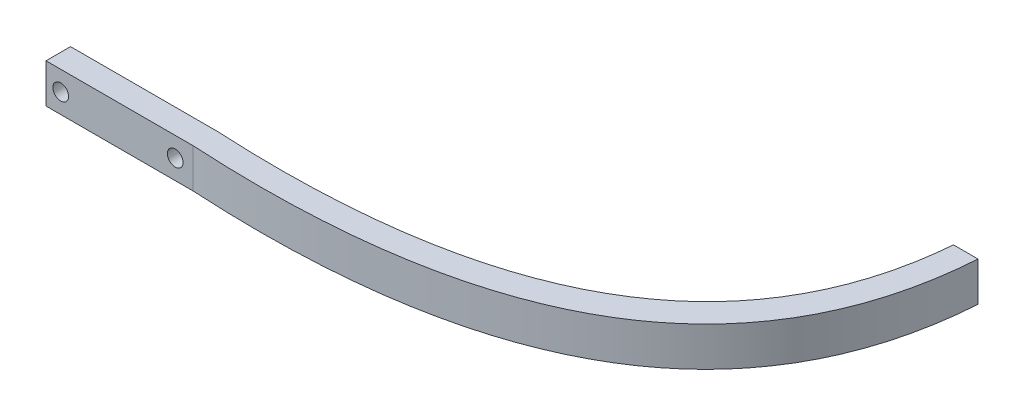
ISO-10303-21;
HEADER;
FILE_DESCRIPTION(('STEP AP214'),'2;1');
FILE_NAME('part.step','',(''),(''),'','','');
FILE_SCHEMA(('AUTOMOTIVE_DESIGN { 1 0 10303 214 1 1 1 1 }'));
ENDSEC;
DATA;
#1=APPLICATION_CONTEXT('core data for automotive mechanical design processes');
#2=APPLICATION_PROTOCOL_DEFINITION('international standard','automotive_design',2000,#1);
#3=PRODUCT_CONTEXT('',#1,'mechanical');
#4=PRODUCT('Part','Part','',(#3));
#5=PRODUCT_RELATED_PRODUCT_CATEGORY('part','',(#4));
#6=PRODUCT_DEFINITION_FORMATION('','',#4);
#7=PRODUCT_DEFINITION_CONTEXT('part definition',#1,'design');
#8=PRODUCT_DEFINITION('design','',#6,#7);
#9=PRODUCT_DEFINITION_SHAPE('','',#8);
#10=(LENGTH_UNIT() NAMED_UNIT(*) SI_UNIT(.MILLI.,.METRE.));
#11=(NAMED_UNIT(*) PLANE_ANGLE_UNIT() SI_UNIT($,.RADIAN.));
#12=(NAMED_UNIT(*) SI_UNIT($,.STERADIAN.) SOLID_ANGLE_UNIT());
#13=UNCERTAINTY_MEASURE_WITH_UNIT(LENGTH_MEASURE(1.E-05),#10,'distance_accuracy_value','');
#14=(GEOMETRIC_REPRESENTATION_CONTEXT(3) GLOBAL_UNCERTAINTY_ASSIGNED_CONTEXT((#13)) GLOBAL_UNIT_ASSIGNED_CONTEXT((#10,
#11,#12)) REPRESENTATION_CONTEXT('',''));
#15=CARTESIAN_POINT('',(0.,0.,0.));
#16=DIRECTION('',(0.,0.,1.));
#17=DIRECTION('',(1.,0.,0.));
#18=AXIS2_PLACEMENT_3D('',#15,#16,#17);
#19=CARTESIAN_POINT('',(25.674832789617,8.,2.23902973954786));
#20=CARTESIAN_POINT('',(121.287593370321,8.,7.64344306096118));
#21=CARTESIAN_POINT('',(125.674832789617,8.,-57.7609702604522));
#22=B_SPLINE_CURVE_WITH_KNOTS('',2,(#19,#20,#21),.UNSPECIFIED.,.F.,.F.,(3,3),(0.,1.),.UNSPECIFIED.);
#23=DIRECTION('',(0.,-1.,0.));
#24=VECTOR('',#23,1.);
#25=SURFACE_OF_LINEAR_EXTRUSION('',#22,#24);
#26=CARTESIAN_POINT('',(25.674832789617,0.,2.23902973954786));
#27=CARTESIAN_POINT('',(121.287593370321,0.,7.64344306096118));
#28=CARTESIAN_POINT('',(125.674832789617,0.,-57.7609702604522));
#29=B_SPLINE_CURVE_WITH_KNOTS('',2,(#26,#27,#28),.UNSPECIFIED.,.F.,.F.,(3,3),(0.,1.),.UNSPECIFIED.);
#30=CARTESIAN_POINT('',(25.6748327896171,0.,2.23902973954786));
#31=VERTEX_POINT('',#30);
#32=CARTESIAN_POINT('',(125.674832789617,0.,-57.7609702604521));
#33=VERTEX_POINT('',#32);
#34=EDGE_CURVE('E188',#31,#33,#29,.T.);
#35=ORIENTED_EDGE('',*,*,#34,.T.);
#36=DIRECTION('',(0.,-1.,0.));
#37=VECTOR('',#36,1.);
#38=CARTESIAN_POINT('',(125.674832789617,8.,-57.7609702604521));
#39=LINE('',#38,#37);
#40=CARTESIAN_POINT('',(125.674832789617,8.,-57.7609702604521));
#41=VERTEX_POINT('',#40);
#42=EDGE_CURVE('E92',#41,#33,#39,.T.);
#43=ORIENTED_EDGE('',*,*,#42,.F.);
#44=CARTESIAN_POINT('',(25.6748327896171,8.,2.23902973954786));
#45=VERTEX_POINT('',#44);
#46=EDGE_CURVE('E180',#45,#41,#22,.T.);
#47=ORIENTED_EDGE('',*,*,#46,.F.);
#48=DIRECTION('',(0.,-1.,0.));
#49=VECTOR('',#48,1.);
#50=CARTESIAN_POINT('',(25.6748327896171,8.,2.23902973954786));
#51=LINE('',#50,#49);
#52=EDGE_CURVE('E12',#45,#31,#51,.T.);
#53=ORIENTED_EDGE('',*,*,#52,.T.);
#54=EDGE_LOOP('',(#35,#43,#47,#53));
#55=FACE_BOUND('',#54,.T.);
#56=ADVANCED_FACE('F81',(#55),#25,.F.);
#57=CARTESIAN_POINT('',(0.,8.,-57.7609702604521));
#58=DIRECTION('',(0.,0.,-1.));
#59=DIRECTION('',(-1.,0.,0.));
#60=AXIS2_PLACEMENT_3D('',#57,#58,#59);
#61=PLANE('',#60);
#62=DIRECTION('',(1.,0.,0.));
#63=VECTOR('',#62,1.);
#64=CARTESIAN_POINT('',(0.,0.,-57.7609702604521));
#65=LINE('',#64,#63);
#66=CARTESIAN_POINT('',(120.674832789617,0.,-57.7609702604521));
#67=VERTEX_POINT('',#66);
#68=EDGE_CURVE('E181',#67,#33,#65,.T.);
#69=ORIENTED_EDGE('',*,*,#68,.F.);
#70=DIRECTION('',(0.,-1.,0.));
#71=VECTOR('',#70,1.);
#72=CARTESIAN_POINT('',(120.674832789617,8.,-57.7609702604521));
#73=LINE('',#72,#71);
#74=CARTESIAN_POINT('',(120.674832789617,8.,-57.7609702604521));
#75=VERTEX_POINT('',#74);
#76=EDGE_CURVE('E169',#75,#67,#73,.T.);
#77=ORIENTED_EDGE('',*,*,#76,.F.);
#78=DIRECTION('',(1.,0.,0.));
#79=VECTOR('',#78,1.);
#80=CARTESIAN_POINT('',(0.,8.,-57.7609702604521));
#81=LINE('',#80,#79);
#82=EDGE_CURVE('E202',#75,#41,#81,.T.);
#83=ORIENTED_EDGE('',*,*,#82,.T.);
#84=ORIENTED_EDGE('',*,*,#42,.T.);
#85=EDGE_LOOP('',(#69,#77,#83,#84));
#86=FACE_BOUND('',#85,.T.);
#87=ADVANCED_FACE('F213',(#86),#61,.T.);
#88=CARTESIAN_POINT('',(25.674832789617,8.,-2.76097026045214));
#89=CARTESIAN_POINT('',(115.693231060421,8.,1.98576260505165));
#90=CARTESIAN_POINT('',(120.674832789617,8.,-57.7609702604522));
#91=B_SPLINE_CURVE_WITH_KNOTS('',2,(#88,#89,#90),.UNSPECIFIED.,.F.,.F.,(3,3),(0.,1.),.UNSPECIFIED.);
#92=DIRECTION('',(0.,-1.,0.));
#93=VECTOR('',#92,1.);
#94=SURFACE_OF_LINEAR_EXTRUSION('',#91,#93);
#95=CARTESIAN_POINT('',(25.674832789617,0.,-2.76097026045214));
#96=CARTESIAN_POINT('',(115.693231060421,0.,1.98576260505165));
#97=CARTESIAN_POINT('',(120.674832789617,0.,-57.7609702604522));
#98=B_SPLINE_CURVE_WITH_KNOTS('',2,(#95,#96,#97),.UNSPECIFIED.,.F.,.F.,(3,3),(0.,1.),.UNSPECIFIED.);
#99=CARTESIAN_POINT('',(25.674832789617,0.,-2.76097026045214));
#100=VERTEX_POINT('',#99);
#101=EDGE_CURVE('E175',#100,#67,#98,.T.);
#102=ORIENTED_EDGE('',*,*,#101,.F.);
#103=DIRECTION('',(0.,-1.,0.));
#104=VECTOR('',#103,1.);
#105=CARTESIAN_POINT('',(25.674832789617,8.,-2.76097026045214));
#106=LINE('',#105,#104);
#107=CARTESIAN_POINT('',(25.674832789617,8.,-2.76097026045214));
#108=VERTEX_POINT('',#107);
#109=EDGE_CURVE('E101',#108,#100,#106,.T.);
#110=ORIENTED_EDGE('',*,*,#109,.F.);
#111=EDGE_CURVE('E174',#108,#75,#91,.T.);
#112=ORIENTED_EDGE('',*,*,#111,.T.);
#113=ORIENTED_EDGE('',*,*,#76,.T.);
#114=EDGE_LOOP('',(#102,#110,#112,#113));
#115=FACE_BOUND('',#114,.T.);
#116=ADVANCED_FACE('F208',(#115),#94,.T.);
#117=CARTESIAN_POINT('',(0.,8.,0.));
#118=DIRECTION('',(0.,1.,0.));
#119=DIRECTION('',(0.,0.,1.));
#120=AXIS2_PLACEMENT_3D('',#117,#118,#119);
#121=PLANE('',#120);
#122=ORIENTED_EDGE('',*,*,#111,.F.);
#123=DIRECTION('',(1.,0.,0.));
#124=VECTOR('',#123,1.);
#125=CARTESIAN_POINT('',(-4.32516721038295,8.,-2.76097026045214));
#126=LINE('',#125,#124);
#127=CARTESIAN_POINT('',(-4.32516721038295,8.,-2.76097026045214));
#128=VERTEX_POINT('',#127);
#129=EDGE_CURVE('E145',#128,#108,#126,.T.);
#130=ORIENTED_EDGE('',*,*,#129,.F.);
#131=DIRECTION('',(0.,0.,1.));
#132=VECTOR('',#131,1.);
#133=CARTESIAN_POINT('',(-4.32516721038295,8.,-2.76097026045214));
#134=LINE('',#133,#132);
#135=CARTESIAN_POINT('',(-4.32516721038294,8.,2.23902973954786));
#136=VERTEX_POINT('',#135);
#137=EDGE_CURVE('E140',#128,#136,#134,.T.);
#138=ORIENTED_EDGE('',*,*,#137,.T.);
#139=DIRECTION('',(1.,0.,0.));
#140=VECTOR('',#139,1.);
#141=CARTESIAN_POINT('',(-4.32516721038294,8.,2.23902973954786));
#142=LINE('',#141,#140);
#143=EDGE_CURVE('E158',#136,#45,#142,.T.);
#144=ORIENTED_EDGE('',*,*,#143,.T.);
#145=ORIENTED_EDGE('',*,*,#46,.T.);
#146=ORIENTED_EDGE('',*,*,#82,.F.);
#147=EDGE_LOOP('',(#122,#130,#138,#144,#145,#146));
#148=FACE_BOUND('',#147,.T.);
#149=ADVANCED_FACE('F212',(#148),#121,.T.);
#150=CARTESIAN_POINT('',(0.,0.,0.));
#151=DIRECTION('',(0.,1.,0.));
#152=DIRECTION('',(0.,0.,1.));
#153=AXIS2_PLACEMENT_3D('',#150,#151,#152);
#154=PLANE('',#153);
#155=ORIENTED_EDGE('',*,*,#34,.F.);
#156=DIRECTION('',(1.,0.,0.));
#157=VECTOR('',#156,1.);
#158=CARTESIAN_POINT('',(-4.32516721038294,0.,2.23902973954786));
#159=LINE('',#158,#157);
#160=CARTESIAN_POINT('',(-4.32516721038294,0.,2.23902973954786));
#161=VERTEX_POINT('',#160);
#162=EDGE_CURVE('E130',#161,#31,#159,.T.);
#163=ORIENTED_EDGE('',*,*,#162,.F.);
#164=DIRECTION('',(0.,0.,1.));
#165=VECTOR('',#164,1.);
#166=CARTESIAN_POINT('',(-4.32516721038295,0.,-2.76097026045214));
#167=LINE('',#166,#165);
#168=CARTESIAN_POINT('',(-4.32516721038295,0.,-2.76097026045214));
#169=VERTEX_POINT('',#168);
#170=EDGE_CURVE('E138',#169,#161,#167,.T.);
#171=ORIENTED_EDGE('',*,*,#170,.F.);
#172=DIRECTION('',(1.,0.,0.));
#173=VECTOR('',#172,1.);
#174=CARTESIAN_POINT('',(-4.32516721038295,0.,-2.76097026045214));
#175=LINE('',#174,#173);
#176=EDGE_CURVE('E149',#169,#100,#175,.T.);
#177=ORIENTED_EDGE('',*,*,#176,.T.);
#178=ORIENTED_EDGE('',*,*,#101,.T.);
#179=ORIENTED_EDGE('',*,*,#68,.T.);
#180=EDGE_LOOP('',(#155,#163,#171,#177,#178,#179));
#181=FACE_BOUND('',#180,.T.);
#182=ADVANCED_FACE('F147',(#181),#154,.F.);
#183=CARTESIAN_POINT('',(-4.32516721038294,8.,2.23902973954786));
#184=DIRECTION('',(0.,0.,-1.));
#185=DIRECTION('',(-1.,0.,0.));
#186=AXIS2_PLACEMENT_3D('',#183,#184,#185);
#187=PLANE('',#186);
#188=CARTESIAN_POINT('',(22.014832789617,4.,2.23902973954786));
#189=DIRECTION('',(0.,0.,-1.));
#190=DIRECTION('',(-1.,0.,0.));
#191=AXIS2_PLACEMENT_3D('',#188,#189,#190);
#192=CIRCLE('',#191,1.6);
#193=CARTESIAN_POINT('',(20.414832789617,4.,2.23902973954786));
#194=VERTEX_POINT('',#193);
#195=EDGE_CURVE('E151',#194,#194,#192,.T.);
#196=ORIENTED_EDGE('',*,*,#195,.T.);
#197=EDGE_LOOP('',(#196));
#198=FACE_BOUND('',#197,.T.);
#199=CARTESIAN_POINT('',(-1.32516721038295,4.,2.23902973954786));
#200=DIRECTION('',(0.,0.,-1.));
#201=DIRECTION('',(-1.,0.,0.));
#202=AXIS2_PLACEMENT_3D('',#199,#200,#201);
#203=CIRCLE('',#202,1.6);
#204=CARTESIAN_POINT('',(-2.92516721038295,4.,2.23902973954786));
#205=VERTEX_POINT('',#204);
#206=EDGE_CURVE('E233',#205,#205,#203,.T.);
#207=ORIENTED_EDGE('',*,*,#206,.T.);
#208=EDGE_LOOP('',(#207));
#209=FACE_BOUND('',#208,.T.);
#210=ORIENTED_EDGE('',*,*,#162,.T.);
#211=ORIENTED_EDGE('',*,*,#52,.F.);
#212=ORIENTED_EDGE('',*,*,#143,.F.);
#213=DIRECTION('',(0.,-1.,0.));
#214=VECTOR('',#213,1.);
#215=CARTESIAN_POINT('',(-4.32516721038294,8.,2.23902973954786));
#216=LINE('',#215,#214);
#217=EDGE_CURVE('E85',#136,#161,#216,.T.);
#218=ORIENTED_EDGE('',*,*,#217,.T.);
#219=EDGE_LOOP('',(#210,#211,#212,#218));
#220=FACE_BOUND('',#219,.T.);
#221=ADVANCED_FACE('F252',(#198,#209,#220),#187,.F.);
#222=CARTESIAN_POINT('',(-4.32516721038295,8.,-2.76097026045214));
#223=DIRECTION('',(1.,0.,0.));
#224=DIRECTION('',(0.,0.,-1.));
#225=AXIS2_PLACEMENT_3D('',#222,#223,#224);
#226=PLANE('',#225);
#227=ORIENTED_EDGE('',*,*,#170,.T.);
#228=ORIENTED_EDGE('',*,*,#217,.F.);
#229=ORIENTED_EDGE('',*,*,#137,.F.);
#230=DIRECTION('',(0.,-1.,0.));
#231=VECTOR('',#230,1.);
#232=CARTESIAN_POINT('',(-4.32516721038295,8.,-2.76097026045214));
#233=LINE('',#232,#231);
#234=EDGE_CURVE('E136',#128,#169,#233,.T.);
#235=ORIENTED_EDGE('',*,*,#234,.T.);
#236=EDGE_LOOP('',(#227,#228,#229,#235));
#237=FACE_BOUND('',#236,.T.);
#238=ADVANCED_FACE('F83',(#237),#226,.F.);
#239=CARTESIAN_POINT('',(-4.32516721038295,8.,-2.76097026045214));
#240=DIRECTION('',(0.,0.,-1.));
#241=DIRECTION('',(-1.,0.,0.));
#242=AXIS2_PLACEMENT_3D('',#239,#240,#241);
#243=PLANE('',#242);
#244=CARTESIAN_POINT('',(22.014832789617,4.,-2.76097026045214));
#245=DIRECTION('',(0.,0.,-1.));
#246=DIRECTION('',(-1.,0.,0.));
#247=AXIS2_PLACEMENT_3D('',#244,#245,#246);
#248=CIRCLE('',#247,1.6);
#249=CARTESIAN_POINT('',(20.414832789617,4.,-2.76097026045214));
#250=VERTEX_POINT('',#249);
#251=EDGE_CURVE('E237',#250,#250,#248,.T.);
#252=ORIENTED_EDGE('',*,*,#251,.F.);
#253=EDGE_LOOP('',(#252));
#254=FACE_BOUND('',#253,.T.);
#255=CARTESIAN_POINT('',(-1.32516721038295,4.,-2.76097026045214));
#256=DIRECTION('',(0.,0.,-1.));
#257=DIRECTION('',(-1.,0.,0.));
#258=AXIS2_PLACEMENT_3D('',#255,#256,#257);
#259=CIRCLE('',#258,1.6);
#260=CARTESIAN_POINT('',(-2.92516721038295,4.,-2.76097026045214));
#261=VERTEX_POINT('',#260);
#262=EDGE_CURVE('E238',#261,#261,#259,.T.);
#263=ORIENTED_EDGE('',*,*,#262,.F.);
#264=EDGE_LOOP('',(#263));
#265=FACE_BOUND('',#264,.T.);
#266=ORIENTED_EDGE('',*,*,#176,.F.);
#267=ORIENTED_EDGE('',*,*,#234,.F.);
#268=ORIENTED_EDGE('',*,*,#129,.T.);
#269=ORIENTED_EDGE('',*,*,#109,.T.);
#270=EDGE_LOOP('',(#266,#267,#268,#269));
#271=FACE_BOUND('',#270,.T.);
#272=ADVANCED_FACE('F153',(#254,#265,#271),#243,.T.);
#273=CARTESIAN_POINT('',(-1.32516721038295,4.,7.23902973954786));
#274=DIRECTION('',(0.,0.,-1.));
#275=DIRECTION('',(-1.,0.,0.));
#276=AXIS2_PLACEMENT_3D('',#273,#274,#275);
#277=CYLINDRICAL_SURFACE('',#276,1.6);
#278=ORIENTED_EDGE('',*,*,#262,.T.);
#279=EDGE_LOOP('',(#278));
#280=FACE_BOUND('',#279,.T.);
#281=ORIENTED_EDGE('',*,*,#206,.F.);
#282=EDGE_LOOP('',(#281));
#283=FACE_BOUND('',#282,.T.);
#284=ADVANCED_FACE('F251',(#280,#283),#277,.F.);
#285=CARTESIAN_POINT('',(22.014832789617,4.,7.23902973954786));
#286=DIRECTION('',(0.,0.,-1.));
#287=DIRECTION('',(-1.,0.,0.));
#288=AXIS2_PLACEMENT_3D('',#285,#286,#287);
#289=CYLINDRICAL_SURFACE('',#288,1.6);
#290=ORIENTED_EDGE('',*,*,#251,.T.);
#291=EDGE_LOOP('',(#290));
#292=FACE_BOUND('',#291,.T.);
#293=ORIENTED_EDGE('',*,*,#195,.F.);
#294=EDGE_LOOP('',(#293));
#295=FACE_BOUND('',#294,.T.);
#296=ADVANCED_FACE('F246',(#292,#295),#289,.F.);
#297=CLOSED_SHELL('',(#56,#87,#116,#149,#182,#221,#238,#272,#284,#296));
#298=MANIFOLD_SOLID_BREP('B2',#297);
#299=ADVANCED_BREP_SHAPE_REPRESENTATION('',(#18,#298),#14);
#300=SHAPE_DEFINITION_REPRESENTATION(#9,#299);
ENDSEC;
END-ISO-10303-21;
